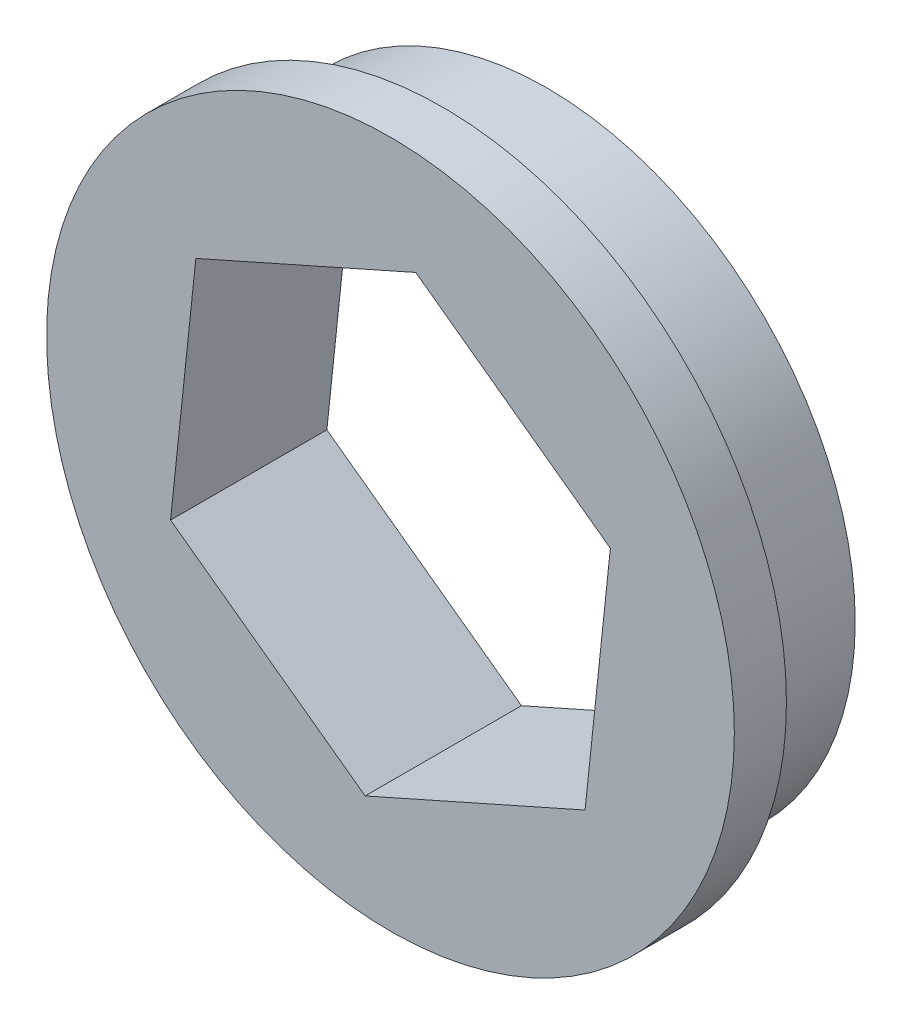
ISO-10303-21;
HEADER;
FILE_DESCRIPTION(('STEP AP214'),'2;1');
FILE_NAME('part.step','',(''),(''),'','','');
FILE_SCHEMA(('AUTOMOTIVE_DESIGN { 1 0 10303 214 1 1 1 1 }'));
ENDSEC;
DATA;
#1=APPLICATION_CONTEXT('core data for automotive mechanical design processes');
#2=APPLICATION_PROTOCOL_DEFINITION('international standard','automotive_design',2000,#1);
#3=PRODUCT_CONTEXT('',#1,'mechanical');
#4=PRODUCT('Part','Part','',(#3));
#5=PRODUCT_RELATED_PRODUCT_CATEGORY('part','',(#4));
#6=PRODUCT_DEFINITION_FORMATION('','',#4);
#7=PRODUCT_DEFINITION_CONTEXT('part definition',#1,'design');
#8=PRODUCT_DEFINITION('design','',#6,#7);
#9=PRODUCT_DEFINITION_SHAPE('','',#8);
#10=(LENGTH_UNIT() NAMED_UNIT(*) SI_UNIT(.MILLI.,.METRE.));
#11=(NAMED_UNIT(*) PLANE_ANGLE_UNIT() SI_UNIT($,.RADIAN.));
#12=(NAMED_UNIT(*) SI_UNIT($,.STERADIAN.) SOLID_ANGLE_UNIT());
#13=UNCERTAINTY_MEASURE_WITH_UNIT(LENGTH_MEASURE(1.E-05),#10,'distance_accuracy_value','');
#14=(GEOMETRIC_REPRESENTATION_CONTEXT(3) GLOBAL_UNCERTAINTY_ASSIGNED_CONTEXT((#13)) GLOBAL_UNIT_ASSIGNED_CONTEXT((#10,
#11,#12)) REPRESENTATION_CONTEXT('',''));
#15=CARTESIAN_POINT('',(0.,0.,0.));
#16=DIRECTION('',(0.,0.,1.));
#17=DIRECTION('',(1.,0.,0.));
#18=AXIS2_PLACEMENT_3D('',#15,#16,#17);
#19=CARTESIAN_POINT('',(0.,0.,0.));
#20=DIRECTION('',(0.,0.,1.));
#21=DIRECTION('',(1.,0.,0.));
#22=AXIS2_PLACEMENT_3D('',#19,#20,#21);
#23=PLANE('',#22);
#24=CARTESIAN_POINT('',(0.,0.,0.));
#25=DIRECTION('',(0.,0.,1.));
#26=DIRECTION('',(1.,0.,0.));
#27=AXIS2_PLACEMENT_3D('',#24,#25,#26);
#28=CIRCLE('',#27,9.398);
#29=CARTESIAN_POINT('',(9.398,0.,0.));
#30=VERTEX_POINT('',#29);
#31=EDGE_CURVE('E36',#30,#30,#28,.T.);
#32=ORIENTED_EDGE('',*,*,#31,.F.);
#33=EDGE_LOOP('',(#32));
#34=FACE_BOUND('',#33,.T.);
#35=DIRECTION('',(-0.808654886382194,0.588283328618279,0.));
#36=VECTOR('',#35,1.);
#37=CARTESIAN_POINT('',(6.70026882544866,2.9782093613536,0.));
#38=LINE('',#37,#36);
#39=CARTESIAN_POINT('',(6.70026882544866,2.9782093613536,0.));
#40=VERTEX_POINT('',#39);
#41=CARTESIAN_POINT('',(0.770929448003483,7.29170769570026,0.));
#42=VERTEX_POINT('',#41);
#43=EDGE_CURVE('E47',#40,#42,#38,.T.);
#44=ORIENTED_EDGE('',*,*,#43,.T.);
#45=DIRECTION('',(-0.913795750397395,-0.406174010192259,0.));
#46=VECTOR('',#45,1.);
#47=CARTESIAN_POINT('',(0.770929448003483,7.29170769570026,0.));
#48=LINE('',#47,#46);
#49=CARTESIAN_POINT('',(-5.92933937744517,4.31349833434667,0.));
#50=VERTEX_POINT('',#49);
#51=EDGE_CURVE('E93',#42,#50,#48,.T.);
#52=ORIENTED_EDGE('',*,*,#51,.T.);
#53=DIRECTION('',(-0.105140864015202,-0.994457338810538,0.));
#54=VECTOR('',#53,1.);
#55=CARTESIAN_POINT('',(-5.92933937744517,4.31349833434667,0.));
#56=LINE('',#55,#54);
#57=CARTESIAN_POINT('',(-6.70026882544866,-2.9782093613536,0.));
#58=VERTEX_POINT('',#57);
#59=EDGE_CURVE('E126',#50,#58,#56,.T.);
#60=ORIENTED_EDGE('',*,*,#59,.T.);
#61=DIRECTION('',(0.808654886382194,-0.588283328618279,0.));
#62=VECTOR('',#61,1.);
#63=CARTESIAN_POINT('',(-6.70026882544866,-2.9782093613536,0.));
#64=LINE('',#63,#62);
#65=CARTESIAN_POINT('',(-0.770929448003481,-7.29170769570026,0.));
#66=VERTEX_POINT('',#65);
#67=EDGE_CURVE('E129',#58,#66,#64,.T.);
#68=ORIENTED_EDGE('',*,*,#67,.T.);
#69=DIRECTION('',(0.913795750397395,0.406174010192259,0.));
#70=VECTOR('',#69,1.);
#71=CARTESIAN_POINT('',(-0.770929448003481,-7.29170769570026,0.));
#72=LINE('',#71,#70);
#73=CARTESIAN_POINT('',(5.92933937744517,-4.31349833434667,0.));
#74=VERTEX_POINT('',#73);
#75=EDGE_CURVE('E132',#66,#74,#72,.T.);
#76=ORIENTED_EDGE('',*,*,#75,.T.);
#77=DIRECTION('',(0.105140864015202,0.994457338810538,0.));
#78=VECTOR('',#77,1.);
#79=CARTESIAN_POINT('',(5.92933937744517,-4.31349833434667,0.));
#80=LINE('',#79,#78);
#81=EDGE_CURVE('E135',#74,#40,#80,.T.);
#82=ORIENTED_EDGE('',*,*,#81,.T.);
#83=EDGE_LOOP('',(#44,#52,#60,#68,#76,#82));
#84=FACE_BOUND('',#83,.T.);
#85=ADVANCED_FACE('F32',(#34,#84),#23,.F.);
#86=CARTESIAN_POINT('',(0.,0.,3.175));
#87=DIRECTION('',(0.,0.,-1.));
#88=DIRECTION('',(-1.,0.,0.));
#89=AXIS2_PLACEMENT_3D('',#86,#87,#88);
#90=CYLINDRICAL_SURFACE('',#89,9.398);
#91=CARTESIAN_POINT('',(0.,0.,3.175));
#92=DIRECTION('',(0.,0.,1.));
#93=DIRECTION('',(1.,0.,0.));
#94=AXIS2_PLACEMENT_3D('',#91,#92,#93);
#95=CIRCLE('',#94,9.398);
#96=CARTESIAN_POINT('',(9.398,0.,3.175));
#97=VERTEX_POINT('',#96);
#98=EDGE_CURVE('E11',#97,#97,#95,.T.);
#99=ORIENTED_EDGE('',*,*,#98,.F.);
#100=EDGE_LOOP('',(#99));
#101=FACE_BOUND('',#100,.T.);
#102=ORIENTED_EDGE('',*,*,#31,.T.);
#103=EDGE_LOOP('',(#102));
#104=FACE_BOUND('',#103,.T.);
#105=ADVANCED_FACE('F34',(#101,#104),#90,.T.);
#106=CARTESIAN_POINT('',(6.70026882544866,2.9782093613536,3.175));
#107=DIRECTION('',(-0.588283328618279,-0.808654886382193,0.));
#108=DIRECTION('',(0.808654886382194,-0.588283328618279,0.));
#109=AXIS2_PLACEMENT_3D('',#106,#107,#108);
#110=PLANE('',#109);
#111=ORIENTED_EDGE('',*,*,#43,.F.);
#112=DIRECTION('',(0.,0.,-1.));
#113=VECTOR('',#112,1.);
#114=CARTESIAN_POINT('',(6.70026882544866,2.9782093613536,3.175));
#115=LINE('',#114,#113);
#116=CARTESIAN_POINT('',(6.70026882544863,2.97820936135367,4.7625));
#117=VERTEX_POINT('',#116);
#118=EDGE_CURVE('E99',#117,#40,#115,.T.);
#119=ORIENTED_EDGE('',*,*,#118,.F.);
#120=DIRECTION('',(-0.8086548863822,0.58828332861827,0.));
#121=VECTOR('',#120,1.);
#122=CARTESIAN_POINT('',(6.70026882544863,2.97820936135367,4.7625));
#123=LINE('',#122,#121);
#124=CARTESIAN_POINT('',(0.770929448003407,7.29170769570027,4.7625));
#125=VERTEX_POINT('',#124);
#126=EDGE_CURVE('E97',#117,#125,#123,.T.);
#127=ORIENTED_EDGE('',*,*,#126,.T.);
#128=DIRECTION('',(0.,0.,-1.));
#129=VECTOR('',#128,1.);
#130=CARTESIAN_POINT('',(0.770929448003483,7.29170769570026,3.175));
#131=LINE('',#130,#129);
#132=EDGE_CURVE('E86',#125,#42,#131,.T.);
#133=ORIENTED_EDGE('',*,*,#132,.T.);
#134=EDGE_LOOP('',(#111,#119,#127,#133));
#135=FACE_BOUND('',#134,.T.);
#136=ADVANCED_FACE('F98',(#135),#110,.T.);
#137=CARTESIAN_POINT('',(0.770929448003483,7.29170769570026,3.175));
#138=DIRECTION('',(0.406174010192259,-0.913795750397395,0.));
#139=DIRECTION('',(0.913795750397395,0.406174010192259,0.));
#140=AXIS2_PLACEMENT_3D('',#137,#138,#139);
#141=PLANE('',#140);
#142=ORIENTED_EDGE('',*,*,#51,.F.);
#143=ORIENTED_EDGE('',*,*,#132,.F.);
#144=DIRECTION('',(-0.913795750397391,-0.406174010192269,0.));
#145=VECTOR('',#144,1.);
#146=CARTESIAN_POINT('',(0.770929448003407,7.29170769570027,4.7625));
#147=LINE('',#146,#145);
#148=CARTESIAN_POINT('',(-5.92933937744522,4.3134983343466,4.7625));
#149=VERTEX_POINT('',#148);
#150=EDGE_CURVE('E90',#125,#149,#147,.T.);
#151=ORIENTED_EDGE('',*,*,#150,.T.);
#152=DIRECTION('',(0.,0.,-1.));
#153=VECTOR('',#152,1.);
#154=CARTESIAN_POINT('',(-5.92933937744517,4.31349833434667,3.175));
#155=LINE('',#154,#153);
#156=EDGE_CURVE('E94',#149,#50,#155,.T.);
#157=ORIENTED_EDGE('',*,*,#156,.T.);
#158=EDGE_LOOP('',(#142,#143,#151,#157));
#159=FACE_BOUND('',#158,.T.);
#160=ADVANCED_FACE('F88',(#159),#141,.T.);
#161=CARTESIAN_POINT('',(-5.92933937744517,4.31349833434667,3.175));
#162=DIRECTION('',(0.994457338810538,-0.105140864015202,0.));
#163=DIRECTION('',(0.105140864015202,0.994457338810538,0.));
#164=AXIS2_PLACEMENT_3D('',#161,#162,#163);
#165=PLANE('',#164);
#166=ORIENTED_EDGE('',*,*,#59,.F.);
#167=ORIENTED_EDGE('',*,*,#156,.F.);
#168=DIRECTION('',(-0.105140864015191,-0.994457338810539,0.));
#169=VECTOR('',#168,1.);
#170=CARTESIAN_POINT('',(-5.92933937744522,4.3134983343466,4.7625));
#171=LINE('',#170,#169);
#172=CARTESIAN_POINT('',(-6.70026882544863,-2.97820936135367,4.7625));
#173=VERTEX_POINT('',#172);
#174=EDGE_CURVE('E107',#149,#173,#171,.T.);
#175=ORIENTED_EDGE('',*,*,#174,.T.);
#176=DIRECTION('',(0.,0.,-1.));
#177=VECTOR('',#176,1.);
#178=CARTESIAN_POINT('',(-6.70026882544866,-2.9782093613536,3.175));
#179=LINE('',#178,#177);
#180=EDGE_CURVE('E142',#173,#58,#179,.T.);
#181=ORIENTED_EDGE('',*,*,#180,.T.);
#182=EDGE_LOOP('',(#166,#167,#175,#181));
#183=FACE_BOUND('',#182,.T.);
#184=ADVANCED_FACE('F146',(#183),#165,.T.);
#185=CARTESIAN_POINT('',(-6.70026882544866,-2.9782093613536,3.175));
#186=DIRECTION('',(0.588283328618279,0.808654886382194,0.));
#187=DIRECTION('',(-0.808654886382194,0.588283328618279,0.));
#188=AXIS2_PLACEMENT_3D('',#185,#186,#187);
#189=PLANE('',#188);
#190=ORIENTED_EDGE('',*,*,#67,.F.);
#191=ORIENTED_EDGE('',*,*,#180,.F.);
#192=DIRECTION('',(0.8086548863822,-0.58828332861827,0.));
#193=VECTOR('',#192,1.);
#194=CARTESIAN_POINT('',(-6.70026882544863,-2.97820936135367,4.7625));
#195=LINE('',#194,#193);
#196=CARTESIAN_POINT('',(-0.770929448003402,-7.29170769570027,4.7625));
#197=VERTEX_POINT('',#196);
#198=EDGE_CURVE('E109',#173,#197,#195,.T.);
#199=ORIENTED_EDGE('',*,*,#198,.T.);
#200=DIRECTION('',(0.,0.,-1.));
#201=VECTOR('',#200,1.);
#202=CARTESIAN_POINT('',(-0.770929448003481,-7.29170769570026,3.175));
#203=LINE('',#202,#201);
#204=EDGE_CURVE('E140',#197,#66,#203,.T.);
#205=ORIENTED_EDGE('',*,*,#204,.T.);
#206=EDGE_LOOP('',(#190,#191,#199,#205));
#207=FACE_BOUND('',#206,.T.);
#208=ADVANCED_FACE('F154',(#207),#189,.T.);
#209=CARTESIAN_POINT('',(-0.770929448003481,-7.29170769570026,3.175));
#210=DIRECTION('',(-0.406174010192259,0.913795750397395,0.));
#211=DIRECTION('',(-0.913795750397395,-0.406174010192259,0.));
#212=AXIS2_PLACEMENT_3D('',#209,#210,#211);
#213=PLANE('',#212);
#214=ORIENTED_EDGE('',*,*,#75,.F.);
#215=ORIENTED_EDGE('',*,*,#204,.F.);
#216=DIRECTION('',(0.913795750397391,0.406174010192269,0.));
#217=VECTOR('',#216,1.);
#218=CARTESIAN_POINT('',(-0.770929448003402,-7.29170769570027,4.7625));
#219=LINE('',#218,#217);
#220=CARTESIAN_POINT('',(5.92933937744522,-4.3134983343466,4.7625));
#221=VERTEX_POINT('',#220);
#222=EDGE_CURVE('E114',#197,#221,#219,.T.);
#223=ORIENTED_EDGE('',*,*,#222,.T.);
#224=DIRECTION('',(0.,0.,-1.));
#225=VECTOR('',#224,1.);
#226=CARTESIAN_POINT('',(5.92933937744517,-4.31349833434667,3.175));
#227=LINE('',#226,#225);
#228=EDGE_CURVE('E55',#221,#74,#227,.T.);
#229=ORIENTED_EDGE('',*,*,#228,.T.);
#230=EDGE_LOOP('',(#214,#215,#223,#229));
#231=FACE_BOUND('',#230,.T.);
#232=ADVANCED_FACE('F152',(#231),#213,.T.);
#233=CARTESIAN_POINT('',(5.92933937744517,-4.31349833434667,3.175));
#234=DIRECTION('',(-0.994457338810538,0.105140864015202,0.));
#235=DIRECTION('',(-0.105140864015202,-0.994457338810538,0.));
#236=AXIS2_PLACEMENT_3D('',#233,#234,#235);
#237=PLANE('',#236);
#238=ORIENTED_EDGE('',*,*,#81,.F.);
#239=ORIENTED_EDGE('',*,*,#228,.F.);
#240=DIRECTION('',(0.105140864015191,0.994457338810539,0.));
#241=VECTOR('',#240,1.);
#242=CARTESIAN_POINT('',(5.92933937744522,-4.3134983343466,4.7625));
#243=LINE('',#242,#241);
#244=EDGE_CURVE('E116',#221,#117,#243,.T.);
#245=ORIENTED_EDGE('',*,*,#244,.T.);
#246=ORIENTED_EDGE('',*,*,#118,.T.);
#247=EDGE_LOOP('',(#238,#239,#245,#246));
#248=FACE_BOUND('',#247,.T.);
#249=ADVANCED_FACE('F150',(#248),#237,.T.);
#250=CARTESIAN_POINT('',(0.,0.,3.175));
#251=DIRECTION('',(0.,0.,1.));
#252=DIRECTION('',(1.,0.,0.));
#253=AXIS2_PLACEMENT_3D('',#250,#251,#252);
#254=PLANE('',#253);
#255=CARTESIAN_POINT('',(0.,0.,3.175));
#256=DIRECTION('',(0.,0.,1.));
#257=DIRECTION('',(1.,0.,0.));
#258=AXIS2_PLACEMENT_3D('',#255,#256,#257);
#259=CIRCLE('',#258,10.4775);
#260=CARTESIAN_POINT('',(10.4775,0.,3.175));
#261=VERTEX_POINT('',#260);
#262=EDGE_CURVE('E118',#261,#261,#259,.T.);
#263=ORIENTED_EDGE('',*,*,#262,.F.);
#264=EDGE_LOOP('',(#263));
#265=FACE_BOUND('',#264,.T.);
#266=ORIENTED_EDGE('',*,*,#98,.T.);
#267=EDGE_LOOP('',(#266));
#268=FACE_BOUND('',#267,.T.);
#269=ADVANCED_FACE('F204',(#265,#268),#254,.F.);
#270=CARTESIAN_POINT('',(0.,0.,4.7625));
#271=DIRECTION('',(0.,0.,1.));
#272=DIRECTION('',(1.,0.,0.));
#273=AXIS2_PLACEMENT_3D('',#270,#271,#272);
#274=PLANE('',#273);
#275=CARTESIAN_POINT('',(0.,0.,4.7625));
#276=DIRECTION('',(0.,0.,1.));
#277=DIRECTION('',(1.,0.,0.));
#278=AXIS2_PLACEMENT_3D('',#275,#276,#277);
#279=CIRCLE('',#278,10.4775);
#280=CARTESIAN_POINT('',(10.4775,0.,4.7625));
#281=VERTEX_POINT('',#280);
#282=EDGE_CURVE('E119',#281,#281,#279,.T.);
#283=ORIENTED_EDGE('',*,*,#282,.T.);
#284=EDGE_LOOP('',(#283));
#285=FACE_BOUND('',#284,.T.);
#286=ORIENTED_EDGE('',*,*,#150,.F.);
#287=ORIENTED_EDGE('',*,*,#126,.F.);
#288=ORIENTED_EDGE('',*,*,#244,.F.);
#289=ORIENTED_EDGE('',*,*,#222,.F.);
#290=ORIENTED_EDGE('',*,*,#198,.F.);
#291=ORIENTED_EDGE('',*,*,#174,.F.);
#292=EDGE_LOOP('',(#286,#287,#288,#289,#290,#291));
#293=FACE_BOUND('',#292,.T.);
#294=ADVANCED_FACE('F104',(#285,#293),#274,.T.);
#295=CARTESIAN_POINT('',(0.,0.,4.7625));
#296=DIRECTION('',(0.,0.,-1.));
#297=DIRECTION('',(-1.,0.,0.));
#298=AXIS2_PLACEMENT_3D('',#295,#296,#297);
#299=CYLINDRICAL_SURFACE('',#298,10.4775);
#300=ORIENTED_EDGE('',*,*,#282,.F.);
#301=EDGE_LOOP('',(#300));
#302=FACE_BOUND('',#301,.T.);
#303=ORIENTED_EDGE('',*,*,#262,.T.);
#304=EDGE_LOOP('',(#303));
#305=FACE_BOUND('',#304,.T.);
#306=ADVANCED_FACE('F223',(#302,#305),#299,.T.);
#307=CLOSED_SHELL('',(#85,#105,#136,#160,#184,#208,#232,#249,#269,#294,#306));
#308=MANIFOLD_SOLID_BREP('B2',#307);
#309=ADVANCED_BREP_SHAPE_REPRESENTATION('',(#18,#308),#14);
#310=SHAPE_DEFINITION_REPRESENTATION(#9,#309);
ENDSEC;
END-ISO-10303-21;
